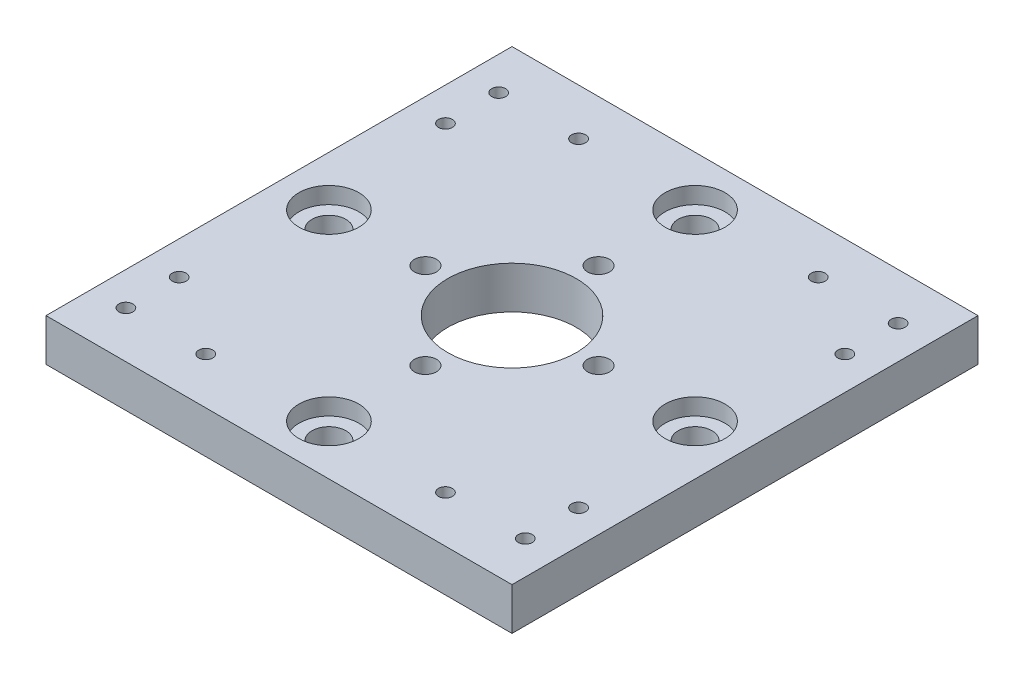
ISO-10303-21;
HEADER;
FILE_DESCRIPTION(('STEP AP214'),'2;1');
FILE_NAME('part.step','',(''),(''),'','','');
FILE_SCHEMA(('AUTOMOTIVE_DESIGN { 1 0 10303 214 1 1 1 1 }'));
ENDSEC;
DATA;
#1=APPLICATION_CONTEXT('core data for automotive mechanical design processes');
#2=APPLICATION_PROTOCOL_DEFINITION('international standard','automotive_design',2000,#1);
#3=PRODUCT_CONTEXT('',#1,'mechanical');
#4=PRODUCT('Part','Part','',(#3));
#5=PRODUCT_RELATED_PRODUCT_CATEGORY('part','',(#4));
#6=PRODUCT_DEFINITION_FORMATION('','',#4);
#7=PRODUCT_DEFINITION_CONTEXT('part definition',#1,'design');
#8=PRODUCT_DEFINITION('design','',#6,#7);
#9=PRODUCT_DEFINITION_SHAPE('','',#8);
#10=(LENGTH_UNIT() NAMED_UNIT(*) SI_UNIT(.MILLI.,.METRE.));
#11=(NAMED_UNIT(*) PLANE_ANGLE_UNIT() SI_UNIT($,.RADIAN.));
#12=(NAMED_UNIT(*) SI_UNIT($,.STERADIAN.) SOLID_ANGLE_UNIT());
#13=UNCERTAINTY_MEASURE_WITH_UNIT(LENGTH_MEASURE(1.E-05),#10,'distance_accuracy_value','');
#14=(GEOMETRIC_REPRESENTATION_CONTEXT(3) GLOBAL_UNCERTAINTY_ASSIGNED_CONTEXT((#13)) GLOBAL_UNIT_ASSIGNED_CONTEXT((#10,
#11,#12)) REPRESENTATION_CONTEXT('',''));
#15=CARTESIAN_POINT('',(0.,0.,0.));
#16=DIRECTION('',(0.,0.,1.));
#17=DIRECTION('',(1.,0.,0.));
#18=AXIS2_PLACEMENT_3D('',#15,#16,#17);
#19=CARTESIAN_POINT('',(1.55309068257925E-12,-0.00100000000000013,27.5));
#20=DIRECTION('',(0.,1.,0.));
#21=DIRECTION('',(0.,0.,1.));
#22=AXIS2_PLACEMENT_3D('',#19,#20,#21);
#23=CYLINDRICAL_SURFACE('',#22,2.55000000000167);
#24=CARTESIAN_POINT('',(1.55309068257925E-12,0.,27.5));
#25=DIRECTION('',(0.,1.,0.));
#26=DIRECTION('',(0.,0.,1.));
#27=AXIS2_PLACEMENT_3D('',#24,#25,#26);
#28=CIRCLE('',#27,2.55000000000167);
#29=CARTESIAN_POINT('',(1.55309068257925E-12,0.,30.0500000000017));
#30=VERTEX_POINT('',#29);
#31=EDGE_CURVE('E141',#30,#30,#28,.F.);
#32=ORIENTED_EDGE('',*,*,#31,.T.);
#33=EDGE_LOOP('',(#32));
#34=FACE_BOUND('',#33,.T.);
#35=CARTESIAN_POINT('',(1.55309068257925E-12,3.85,27.5));
#36=DIRECTION('',(0.,1.,0.));
#37=DIRECTION('',(0.,0.,1.));
#38=AXIS2_PLACEMENT_3D('',#35,#36,#37);
#39=CIRCLE('',#38,2.55000000000167);
#40=CARTESIAN_POINT('',(1.55309068257925E-12,3.85,30.0500000000017));
#41=VERTEX_POINT('',#40);
#42=EDGE_CURVE('E43',#41,#41,#39,.F.);
#43=ORIENTED_EDGE('',*,*,#42,.F.);
#44=EDGE_LOOP('',(#43));
#45=FACE_BOUND('',#44,.T.);
#46=ADVANCED_FACE('F39',(#34,#45),#23,.F.);
#47=CARTESIAN_POINT('',(27.5000000000008,-0.00100000000000013,-7.76545341289627E-13));
#48=DIRECTION('',(0.,1.,0.));
#49=DIRECTION('',(0.,0.,1.));
#50=AXIS2_PLACEMENT_3D('',#47,#48,#49);
#51=CYLINDRICAL_SURFACE('',#50,2.55000000000061);
#52=CARTESIAN_POINT('',(27.5000000000008,0.,-7.76545341289627E-13));
#53=DIRECTION('',(0.,1.,0.));
#54=DIRECTION('',(0.,0.,1.));
#55=AXIS2_PLACEMENT_3D('',#52,#53,#54);
#56=CIRCLE('',#55,2.55000000000061);
#57=CARTESIAN_POINT('',(27.5000000000008,0.,2.54999999999983));
#58=VERTEX_POINT('',#57);
#59=EDGE_CURVE('E145',#58,#58,#56,.F.);
#60=ORIENTED_EDGE('',*,*,#59,.T.);
#61=EDGE_LOOP('',(#60));
#62=FACE_BOUND('',#61,.T.);
#63=CARTESIAN_POINT('',(27.5000000000008,3.85,-7.76545341289627E-13));
#64=DIRECTION('',(0.,1.,0.));
#65=DIRECTION('',(0.,0.,1.));
#66=AXIS2_PLACEMENT_3D('',#63,#64,#65);
#67=CIRCLE('',#66,2.55000000000061);
#68=CARTESIAN_POINT('',(27.5000000000008,3.85,2.54999999999983));
#69=VERTEX_POINT('',#68);
#70=EDGE_CURVE('E136',#69,#69,#67,.F.);
#71=ORIENTED_EDGE('',*,*,#70,.F.);
#72=EDGE_LOOP('',(#71));
#73=FACE_BOUND('',#72,.T.);
#74=ADVANCED_FACE('F264',(#62,#73),#51,.F.);
#75=CARTESIAN_POINT('',(0.,-0.00100000000000013,-27.5));
#76=DIRECTION('',(0.,1.,0.));
#77=DIRECTION('',(0.,0.,1.));
#78=AXIS2_PLACEMENT_3D('',#75,#76,#77);
#79=CYLINDRICAL_SURFACE('',#78,2.55);
#80=CARTESIAN_POINT('',(0.,0.,-27.5));
#81=DIRECTION('',(0.,1.,0.));
#82=DIRECTION('',(0.,0.,1.));
#83=AXIS2_PLACEMENT_3D('',#80,#81,#82);
#84=CIRCLE('',#83,2.55);
#85=CARTESIAN_POINT('',(0.,0.,-24.95));
#86=VERTEX_POINT('',#85);
#87=EDGE_CURVE('E150',#86,#86,#84,.F.);
#88=ORIENTED_EDGE('',*,*,#87,.T.);
#89=EDGE_LOOP('',(#88));
#90=FACE_BOUND('',#89,.T.);
#91=CARTESIAN_POINT('',(0.,3.85,-27.5));
#92=DIRECTION('',(0.,1.,0.));
#93=DIRECTION('',(0.,0.,1.));
#94=AXIS2_PLACEMENT_3D('',#91,#92,#93);
#95=CIRCLE('',#94,2.55);
#96=CARTESIAN_POINT('',(0.,3.85,-24.95));
#97=VERTEX_POINT('',#96);
#98=EDGE_CURVE('E133',#97,#97,#95,.F.);
#99=ORIENTED_EDGE('',*,*,#98,.F.);
#100=EDGE_LOOP('',(#99));
#101=FACE_BOUND('',#100,.T.);
#102=ADVANCED_FACE('F269',(#90,#101),#79,.F.);
#103=CARTESIAN_POINT('',(-27.4999999999992,-0.00100000000000013,7.79913119987283E-13));
#104=DIRECTION('',(0.,1.,0.));
#105=DIRECTION('',(0.,0.,1.));
#106=AXIS2_PLACEMENT_3D('',#103,#104,#105);
#107=CYLINDRICAL_SURFACE('',#106,2.55000000000125);
#108=CARTESIAN_POINT('',(-27.4999999999992,0.,7.79913119987283E-13));
#109=DIRECTION('',(0.,1.,0.));
#110=DIRECTION('',(0.,0.,1.));
#111=AXIS2_PLACEMENT_3D('',#108,#109,#110);
#112=CIRCLE('',#111,2.55000000000125);
#113=CARTESIAN_POINT('',(-27.4999999999992,0.,2.55000000000203));
#114=VERTEX_POINT('',#113);
#115=EDGE_CURVE('E158',#114,#114,#112,.F.);
#116=ORIENTED_EDGE('',*,*,#115,.T.);
#117=EDGE_LOOP('',(#116));
#118=FACE_BOUND('',#117,.T.);
#119=CARTESIAN_POINT('',(-27.4999999999992,3.85,7.79913119987283E-13));
#120=DIRECTION('',(0.,1.,0.));
#121=DIRECTION('',(0.,0.,1.));
#122=AXIS2_PLACEMENT_3D('',#119,#120,#121);
#123=CIRCLE('',#122,2.55000000000125);
#124=CARTESIAN_POINT('',(-27.4999999999992,3.85,2.55000000000203));
#125=VERTEX_POINT('',#124);
#126=EDGE_CURVE('E130',#125,#125,#123,.F.);
#127=ORIENTED_EDGE('',*,*,#126,.F.);
#128=EDGE_LOOP('',(#127));
#129=FACE_BOUND('',#128,.T.);
#130=ADVANCED_FACE('F342',(#118,#129),#107,.F.);
#131=CARTESIAN_POINT('',(0.,6.35,35.));
#132=DIRECTION('',(0.,0.,-1.));
#133=DIRECTION('',(-1.,0.,0.));
#134=AXIS2_PLACEMENT_3D('',#131,#132,#133);
#135=PLANE('',#134);
#136=DIRECTION('',(1.,0.,0.));
#137=VECTOR('',#136,1.);
#138=CARTESIAN_POINT('',(0.,0.,35.));
#139=LINE('',#138,#137);
#140=CARTESIAN_POINT('',(-35.,0.,35.));
#141=VERTEX_POINT('',#140);
#142=CARTESIAN_POINT('',(35.,0.,35.));
#143=VERTEX_POINT('',#142);
#144=EDGE_CURVE('E119',#141,#143,#139,.T.);
#145=ORIENTED_EDGE('',*,*,#144,.T.);
#146=DIRECTION('',(0.,-1.,0.));
#147=VECTOR('',#146,1.);
#148=CARTESIAN_POINT('',(35.,6.35,35.));
#149=LINE('',#148,#147);
#150=CARTESIAN_POINT('',(35.,6.35,35.));
#151=VERTEX_POINT('',#150);
#152=EDGE_CURVE('E11',#151,#143,#149,.T.);
#153=ORIENTED_EDGE('',*,*,#152,.F.);
#154=DIRECTION('',(1.,0.,0.));
#155=VECTOR('',#154,1.);
#156=CARTESIAN_POINT('',(0.,6.35,35.));
#157=LINE('',#156,#155);
#158=CARTESIAN_POINT('',(-35.,6.35,35.));
#159=VERTEX_POINT('',#158);
#160=EDGE_CURVE('E91',#159,#151,#157,.T.);
#161=ORIENTED_EDGE('',*,*,#160,.F.);
#162=DIRECTION('',(0.,-1.,0.));
#163=VECTOR('',#162,1.);
#164=CARTESIAN_POINT('',(-35.,6.35,35.));
#165=LINE('',#164,#163);
#166=EDGE_CURVE('E58',#159,#141,#165,.T.);
#167=ORIENTED_EDGE('',*,*,#166,.T.);
#168=EDGE_LOOP('',(#145,#153,#161,#167));
#169=FACE_BOUND('',#168,.T.);
#170=ADVANCED_FACE('F340',(#169),#135,.F.);
#171=CARTESIAN_POINT('',(35.,6.35,0.));
#172=DIRECTION('',(-1.,0.,0.));
#173=DIRECTION('',(0.,0.,1.));
#174=AXIS2_PLACEMENT_3D('',#171,#172,#173);
#175=PLANE('',#174);
#176=DIRECTION('',(0.,0.,-1.));
#177=VECTOR('',#176,1.);
#178=CARTESIAN_POINT('',(35.,0.,0.));
#179=LINE('',#178,#177);
#180=CARTESIAN_POINT('',(35.,0.,-35.));
#181=VERTEX_POINT('',#180);
#182=EDGE_CURVE('E96',#143,#181,#179,.T.);
#183=ORIENTED_EDGE('',*,*,#182,.T.);
#184=DIRECTION('',(0.,-1.,0.));
#185=VECTOR('',#184,1.);
#186=CARTESIAN_POINT('',(35.,6.35,-35.));
#187=LINE('',#186,#185);
#188=CARTESIAN_POINT('',(35.,6.35,-35.));
#189=VERTEX_POINT('',#188);
#190=EDGE_CURVE('E49',#189,#181,#187,.T.);
#191=ORIENTED_EDGE('',*,*,#190,.F.);
#192=DIRECTION('',(0.,0.,-1.));
#193=VECTOR('',#192,1.);
#194=CARTESIAN_POINT('',(35.,6.35,0.));
#195=LINE('',#194,#193);
#196=EDGE_CURVE('E83',#151,#189,#195,.T.);
#197=ORIENTED_EDGE('',*,*,#196,.F.);
#198=ORIENTED_EDGE('',*,*,#152,.T.);
#199=EDGE_LOOP('',(#183,#191,#197,#198));
#200=FACE_BOUND('',#199,.T.);
#201=ADVANCED_FACE('F95',(#200),#175,.F.);
#202=CARTESIAN_POINT('',(0.,6.35,-35.));
#203=DIRECTION('',(0.,0.,-1.));
#204=DIRECTION('',(-1.,0.,0.));
#205=AXIS2_PLACEMENT_3D('',#202,#203,#204);
#206=PLANE('',#205);
#207=DIRECTION('',(1.,0.,0.));
#208=VECTOR('',#207,1.);
#209=CARTESIAN_POINT('',(0.,0.,-35.));
#210=LINE('',#209,#208);
#211=CARTESIAN_POINT('',(-35.,0.,-35.));
#212=VERTEX_POINT('',#211);
#213=EDGE_CURVE('E122',#212,#181,#210,.T.);
#214=ORIENTED_EDGE('',*,*,#213,.F.);
#215=DIRECTION('',(0.,-1.,0.));
#216=VECTOR('',#215,1.);
#217=CARTESIAN_POINT('',(-35.,6.35,-35.));
#218=LINE('',#217,#216);
#219=CARTESIAN_POINT('',(-35.,6.35,-35.));
#220=VERTEX_POINT('',#219);
#221=EDGE_CURVE('E72',#220,#212,#218,.T.);
#222=ORIENTED_EDGE('',*,*,#221,.F.);
#223=DIRECTION('',(1.,0.,0.));
#224=VECTOR('',#223,1.);
#225=CARTESIAN_POINT('',(0.,6.35,-35.));
#226=LINE('',#225,#224);
#227=EDGE_CURVE('E90',#220,#189,#226,.T.);
#228=ORIENTED_EDGE('',*,*,#227,.T.);
#229=ORIENTED_EDGE('',*,*,#190,.T.);
#230=EDGE_LOOP('',(#214,#222,#228,#229));
#231=FACE_BOUND('',#230,.T.);
#232=ADVANCED_FACE('F100',(#231),#206,.T.);
#233=CARTESIAN_POINT('',(0.,6.35,13.));
#234=DIRECTION('',(0.,-1.,0.));
#235=DIRECTION('',(0.,0.,-1.));
#236=AXIS2_PLACEMENT_3D('',#233,#234,#235);
#237=CYLINDRICAL_SURFACE('',#236,1.65);
#238=CARTESIAN_POINT('',(0.,6.35,13.));
#239=DIRECTION('',(0.,1.,0.));
#240=DIRECTION('',(0.,0.,1.));
#241=AXIS2_PLACEMENT_3D('',#238,#239,#240);
#242=CIRCLE('',#241,1.65);
#243=CARTESIAN_POINT('',(0.,6.35,14.65));
#244=VERTEX_POINT('',#243);
#245=EDGE_CURVE('E240',#244,#244,#242,.T.);
#246=ORIENTED_EDGE('',*,*,#245,.T.);
#247=EDGE_LOOP('',(#246));
#248=FACE_BOUND('',#247,.T.);
#249=CARTESIAN_POINT('',(0.,0.,13.));
#250=DIRECTION('',(0.,1.,0.));
#251=DIRECTION('',(0.,0.,1.));
#252=AXIS2_PLACEMENT_3D('',#249,#250,#251);
#253=CIRCLE('',#252,1.65);
#254=CARTESIAN_POINT('',(0.,0.,14.65));
#255=VERTEX_POINT('',#254);
#256=EDGE_CURVE('E116',#255,#255,#253,.T.);
#257=ORIENTED_EDGE('',*,*,#256,.F.);
#258=EDGE_LOOP('',(#257));
#259=FACE_BOUND('',#258,.T.);
#260=ADVANCED_FACE('F244',(#248,#259),#237,.F.);
#261=CARTESIAN_POINT('',(13.,6.35,0.));
#262=DIRECTION('',(0.,-1.,0.));
#263=DIRECTION('',(0.,0.,-1.));
#264=AXIS2_PLACEMENT_3D('',#261,#262,#263);
#265=CYLINDRICAL_SURFACE('',#264,1.65);
#266=CARTESIAN_POINT('',(13.,6.35,0.));
#267=DIRECTION('',(0.,1.,0.));
#268=DIRECTION('',(0.,0.,1.));
#269=AXIS2_PLACEMENT_3D('',#266,#267,#268);
#270=CIRCLE('',#269,1.65);
#271=CARTESIAN_POINT('',(13.,6.35,1.65));
#272=VERTEX_POINT('',#271);
#273=EDGE_CURVE('E237',#272,#272,#270,.T.);
#274=ORIENTED_EDGE('',*,*,#273,.T.);
#275=EDGE_LOOP('',(#274));
#276=FACE_BOUND('',#275,.T.);
#277=CARTESIAN_POINT('',(13.,0.,0.));
#278=DIRECTION('',(0.,1.,0.));
#279=DIRECTION('',(0.,0.,1.));
#280=AXIS2_PLACEMENT_3D('',#277,#278,#279);
#281=CIRCLE('',#280,1.65);
#282=CARTESIAN_POINT('',(13.,0.,1.65));
#283=VERTEX_POINT('',#282);
#284=EDGE_CURVE('E113',#283,#283,#281,.T.);
#285=ORIENTED_EDGE('',*,*,#284,.F.);
#286=EDGE_LOOP('',(#285));
#287=FACE_BOUND('',#286,.T.);
#288=ADVANCED_FACE('F355',(#276,#287),#265,.F.);
#289=CARTESIAN_POINT('',(0.,6.35,-13.));
#290=DIRECTION('',(0.,-1.,0.));
#291=DIRECTION('',(0.,0.,-1.));
#292=AXIS2_PLACEMENT_3D('',#289,#290,#291);
#293=CYLINDRICAL_SURFACE('',#292,1.65);
#294=CARTESIAN_POINT('',(0.,6.35,-13.));
#295=DIRECTION('',(0.,1.,0.));
#296=DIRECTION('',(0.,0.,1.));
#297=AXIS2_PLACEMENT_3D('',#294,#295,#296);
#298=CIRCLE('',#297,1.65);
#299=CARTESIAN_POINT('',(0.,6.35,-11.35));
#300=VERTEX_POINT('',#299);
#301=EDGE_CURVE('E234',#300,#300,#298,.T.);
#302=ORIENTED_EDGE('',*,*,#301,.T.);
#303=EDGE_LOOP('',(#302));
#304=FACE_BOUND('',#303,.T.);
#305=CARTESIAN_POINT('',(0.,0.,-13.));
#306=DIRECTION('',(0.,1.,0.));
#307=DIRECTION('',(0.,0.,1.));
#308=AXIS2_PLACEMENT_3D('',#305,#306,#307);
#309=CIRCLE('',#308,1.65);
#310=CARTESIAN_POINT('',(0.,0.,-11.35));
#311=VERTEX_POINT('',#310);
#312=EDGE_CURVE('E109',#311,#311,#309,.T.);
#313=ORIENTED_EDGE('',*,*,#312,.F.);
#314=EDGE_LOOP('',(#313));
#315=FACE_BOUND('',#314,.T.);
#316=ADVANCED_FACE('F357',(#304,#315),#293,.F.);
#317=CARTESIAN_POINT('',(-13.,6.35,0.));
#318=DIRECTION('',(0.,-1.,0.));
#319=DIRECTION('',(0.,0.,-1.));
#320=AXIS2_PLACEMENT_3D('',#317,#318,#319);
#321=CYLINDRICAL_SURFACE('',#320,1.65);
#322=CARTESIAN_POINT('',(-13.,6.35,0.));
#323=DIRECTION('',(0.,1.,0.));
#324=DIRECTION('',(0.,0.,1.));
#325=AXIS2_PLACEMENT_3D('',#322,#323,#324);
#326=CIRCLE('',#325,1.65);
#327=CARTESIAN_POINT('',(-13.,6.35,1.65));
#328=VERTEX_POINT('',#327);
#329=EDGE_CURVE('E127',#328,#328,#326,.T.);
#330=ORIENTED_EDGE('',*,*,#329,.T.);
#331=EDGE_LOOP('',(#330));
#332=FACE_BOUND('',#331,.T.);
#333=CARTESIAN_POINT('',(-13.,0.,0.));
#334=DIRECTION('',(0.,1.,0.));
#335=DIRECTION('',(0.,0.,1.));
#336=AXIS2_PLACEMENT_3D('',#333,#334,#335);
#337=CIRCLE('',#336,1.65);
#338=CARTESIAN_POINT('',(-13.,0.,1.65));
#339=VERTEX_POINT('',#338);
#340=EDGE_CURVE('E106',#339,#339,#337,.T.);
#341=ORIENTED_EDGE('',*,*,#340,.F.);
#342=EDGE_LOOP('',(#341));
#343=FACE_BOUND('',#342,.T.);
#344=ADVANCED_FACE('F41',(#332,#343),#321,.F.);
#345=CARTESIAN_POINT('',(-35.,6.35,0.));
#346=DIRECTION('',(-1.,0.,0.));
#347=DIRECTION('',(0.,0.,1.));
#348=AXIS2_PLACEMENT_3D('',#345,#346,#347);
#349=PLANE('',#348);
#350=DIRECTION('',(0.,0.,-1.));
#351=VECTOR('',#350,1.);
#352=CARTESIAN_POINT('',(-35.,0.,0.));
#353=LINE('',#352,#351);
#354=EDGE_CURVE('E124',#141,#212,#353,.T.);
#355=ORIENTED_EDGE('',*,*,#354,.F.);
#356=ORIENTED_EDGE('',*,*,#166,.F.);
#357=DIRECTION('',(0.,0.,-1.));
#358=VECTOR('',#357,1.);
#359=CARTESIAN_POINT('',(-35.,6.35,0.));
#360=LINE('',#359,#358);
#361=EDGE_CURVE('E101',#159,#220,#360,.T.);
#362=ORIENTED_EDGE('',*,*,#361,.T.);
#363=ORIENTED_EDGE('',*,*,#221,.T.);
#364=EDGE_LOOP('',(#355,#356,#362,#363));
#365=FACE_BOUND('',#364,.T.);
#366=ADVANCED_FACE('F249',(#365),#349,.T.);
#367=CARTESIAN_POINT('',(0.,6.35,0.));
#368=DIRECTION('',(0.,1.,0.));
#369=DIRECTION('',(0.,0.,1.));
#370=AXIS2_PLACEMENT_3D('',#367,#368,#369);
#371=PLANE('',#370);
#372=CARTESIAN_POINT('',(0.,6.35,-27.5));
#373=DIRECTION('',(0.,1.,0.));
#374=DIRECTION('',(0.,0.,1.));
#375=AXIS2_PLACEMENT_3D('',#372,#373,#374);
#376=CIRCLE('',#375,4.5);
#377=CARTESIAN_POINT('',(0.,6.35,-23.));
#378=VERTEX_POINT('',#377);
#379=EDGE_CURVE('E709',#378,#378,#376,.T.);
#380=ORIENTED_EDGE('',*,*,#379,.F.);
#381=EDGE_LOOP('',(#380));
#382=FACE_BOUND('',#381,.T.);
#383=CARTESIAN_POINT('',(27.5000000000008,6.35,-7.76545341289627E-13));
#384=DIRECTION('',(0.,1.,0.));
#385=DIRECTION('',(0.,0.,1.));
#386=AXIS2_PLACEMENT_3D('',#383,#384,#385);
#387=CIRCLE('',#386,4.5);
#388=CARTESIAN_POINT('',(27.5000000000008,6.35,4.49999999999923));
#389=VERTEX_POINT('',#388);
#390=EDGE_CURVE('E616',#389,#389,#387,.T.);
#391=ORIENTED_EDGE('',*,*,#390,.F.);
#392=EDGE_LOOP('',(#391));
#393=FACE_BOUND('',#392,.T.);
#394=CARTESIAN_POINT('',(1.55309068257925E-12,6.35,27.5));
#395=DIRECTION('',(0.,1.,0.));
#396=DIRECTION('',(0.,0.,1.));
#397=AXIS2_PLACEMENT_3D('',#394,#395,#396);
#398=CIRCLE('',#397,4.5);
#399=CARTESIAN_POINT('',(1.55309068257925E-12,6.35,32.));
#400=VERTEX_POINT('',#399);
#401=EDGE_CURVE('E611',#400,#400,#398,.T.);
#402=ORIENTED_EDGE('',*,*,#401,.F.);
#403=EDGE_LOOP('',(#402));
#404=FACE_BOUND('',#403,.T.);
#405=CARTESIAN_POINT('',(-27.4999999999992,6.35,7.79913119987283E-13));
#406=DIRECTION('',(0.,1.,0.));
#407=DIRECTION('',(0.,0.,1.));
#408=AXIS2_PLACEMENT_3D('',#405,#406,#407);
#409=CIRCLE('',#408,4.5);
#410=CARTESIAN_POINT('',(-27.4999999999992,6.35,4.50000000000078));
#411=VERTEX_POINT('',#410);
#412=EDGE_CURVE('E618',#411,#411,#409,.T.);
#413=ORIENTED_EDGE('',*,*,#412,.F.);
#414=EDGE_LOOP('',(#413));
#415=FACE_BOUND('',#414,.T.);
#416=CARTESIAN_POINT('',(0.,6.35,0.));
#417=DIRECTION('',(0.,1.,0.));
#418=DIRECTION('',(0.,0.,1.));
#419=AXIS2_PLACEMENT_3D('',#416,#417,#418);
#420=CIRCLE('',#419,9.65);
#421=CARTESIAN_POINT('',(0.,6.35,9.65));
#422=VERTEX_POINT('',#421);
#423=EDGE_CURVE('E154',#422,#422,#420,.T.);
#424=ORIENTED_EDGE('',*,*,#423,.F.);
#425=EDGE_LOOP('',(#424));
#426=FACE_BOUND('',#425,.T.);
#427=CARTESIAN_POINT('',(18.,6.35,28.));
#428=DIRECTION('',(0.,1.,0.));
#429=DIRECTION('',(0.,0.,-1.));
#430=AXIS2_PLACEMENT_3D('',#427,#428,#429);
#431=CIRCLE('',#430,1.05);
#432=CARTESIAN_POINT('',(18.,6.35,26.95));
#433=VERTEX_POINT('',#432);
#434=EDGE_CURVE('E197',#433,#433,#431,.T.);
#435=ORIENTED_EDGE('',*,*,#434,.F.);
#436=EDGE_LOOP('',(#435));
#437=FACE_BOUND('',#436,.T.);
#438=CARTESIAN_POINT('',(30.,6.35,28.));
#439=DIRECTION('',(0.,1.,0.));
#440=DIRECTION('',(0.,0.,-1.));
#441=AXIS2_PLACEMENT_3D('',#438,#439,#440);
#442=CIRCLE('',#441,1.05);
#443=CARTESIAN_POINT('',(30.,6.35,26.95));
#444=VERTEX_POINT('',#443);
#445=EDGE_CURVE('E191',#444,#444,#442,.T.);
#446=ORIENTED_EDGE('',*,*,#445,.F.);
#447=EDGE_LOOP('',(#446));
#448=FACE_BOUND('',#447,.T.);
#449=CARTESIAN_POINT('',(30.,6.35,20.));
#450=DIRECTION('',(0.,1.,0.));
#451=DIRECTION('',(0.,0.,-1.));
#452=AXIS2_PLACEMENT_3D('',#449,#450,#451);
#453=CIRCLE('',#452,1.05);
#454=CARTESIAN_POINT('',(30.,6.35,18.95));
#455=VERTEX_POINT('',#454);
#456=EDGE_CURVE('E184',#455,#455,#453,.T.);
#457=ORIENTED_EDGE('',*,*,#456,.F.);
#458=EDGE_LOOP('',(#457));
#459=FACE_BOUND('',#458,.T.);
#460=CARTESIAN_POINT('',(-18.,6.35,-28.));
#461=DIRECTION('',(0.,1.,0.));
#462=DIRECTION('',(0.,0.,-1.));
#463=AXIS2_PLACEMENT_3D('',#460,#461,#462);
#464=CIRCLE('',#463,1.05);
#465=CARTESIAN_POINT('',(-18.,6.35,-29.05));
#466=VERTEX_POINT('',#465);
#467=EDGE_CURVE('E183',#466,#466,#464,.T.);
#468=ORIENTED_EDGE('',*,*,#467,.F.);
#469=EDGE_LOOP('',(#468));
#470=FACE_BOUND('',#469,.T.);
#471=CARTESIAN_POINT('',(-30.,6.35,-28.));
#472=DIRECTION('',(0.,1.,0.));
#473=DIRECTION('',(0.,0.,-1.));
#474=AXIS2_PLACEMENT_3D('',#471,#472,#473);
#475=CIRCLE('',#474,1.05);
#476=CARTESIAN_POINT('',(-30.,6.35,-29.05));
#477=VERTEX_POINT('',#476);
#478=EDGE_CURVE('E221',#477,#477,#475,.T.);
#479=ORIENTED_EDGE('',*,*,#478,.F.);
#480=EDGE_LOOP('',(#479));
#481=FACE_BOUND('',#480,.T.);
#482=CARTESIAN_POINT('',(-30.,6.35,-20.));
#483=DIRECTION('',(0.,1.,0.));
#484=DIRECTION('',(0.,0.,-1.));
#485=AXIS2_PLACEMENT_3D('',#482,#483,#484);
#486=CIRCLE('',#485,1.05);
#487=CARTESIAN_POINT('',(-30.,6.35,-21.05));
#488=VERTEX_POINT('',#487);
#489=EDGE_CURVE('E215',#488,#488,#486,.T.);
#490=ORIENTED_EDGE('',*,*,#489,.F.);
#491=EDGE_LOOP('',(#490));
#492=FACE_BOUND('',#491,.T.);
#493=CARTESIAN_POINT('',(30.,6.35,-20.));
#494=DIRECTION('',(0.,1.,0.));
#495=DIRECTION('',(0.,0.,1.));
#496=AXIS2_PLACEMENT_3D('',#493,#494,#495);
#497=CIRCLE('',#496,1.05);
#498=CARTESIAN_POINT('',(30.,6.35,-18.95));
#499=VERTEX_POINT('',#498);
#500=EDGE_CURVE('E208',#499,#499,#497,.T.);
#501=ORIENTED_EDGE('',*,*,#500,.F.);
#502=EDGE_LOOP('',(#501));
#503=FACE_BOUND('',#502,.T.);
#504=CARTESIAN_POINT('',(30.,6.35,-28.));
#505=DIRECTION('',(0.,1.,0.));
#506=DIRECTION('',(0.,0.,1.));
#507=AXIS2_PLACEMENT_3D('',#504,#505,#506);
#508=CIRCLE('',#507,1.05);
#509=CARTESIAN_POINT('',(30.,6.35,-26.95));
#510=VERTEX_POINT('',#509);
#511=EDGE_CURVE('E207',#510,#510,#508,.T.);
#512=ORIENTED_EDGE('',*,*,#511,.F.);
#513=EDGE_LOOP('',(#512));
#514=FACE_BOUND('',#513,.T.);
#515=CARTESIAN_POINT('',(-30.,6.35,28.));
#516=DIRECTION('',(0.,1.,0.));
#517=DIRECTION('',(0.,0.,1.));
#518=AXIS2_PLACEMENT_3D('',#515,#516,#517);
#519=CIRCLE('',#518,1.05);
#520=CARTESIAN_POINT('',(-30.,6.35,29.05));
#521=VERTEX_POINT('',#520);
#522=EDGE_CURVE('E164',#521,#521,#519,.T.);
#523=ORIENTED_EDGE('',*,*,#522,.F.);
#524=EDGE_LOOP('',(#523));
#525=FACE_BOUND('',#524,.T.);
#526=CARTESIAN_POINT('',(-30.,6.35,20.));
#527=DIRECTION('',(0.,1.,0.));
#528=DIRECTION('',(0.,0.,1.));
#529=AXIS2_PLACEMENT_3D('',#526,#527,#528);
#530=CIRCLE('',#529,1.05);
#531=CARTESIAN_POINT('',(-30.,6.35,21.05));
#532=VERTEX_POINT('',#531);
#533=EDGE_CURVE('E172',#532,#532,#530,.T.);
#534=ORIENTED_EDGE('',*,*,#533,.F.);
#535=EDGE_LOOP('',(#534));
#536=FACE_BOUND('',#535,.T.);
#537=CARTESIAN_POINT('',(-18.,6.35,28.));
#538=DIRECTION('',(0.,1.,0.));
#539=DIRECTION('',(0.,0.,1.));
#540=AXIS2_PLACEMENT_3D('',#537,#538,#539);
#541=CIRCLE('',#540,1.05);
#542=CARTESIAN_POINT('',(-18.,6.35,29.05));
#543=VERTEX_POINT('',#542);
#544=EDGE_CURVE('E171',#543,#543,#541,.T.);
#545=ORIENTED_EDGE('',*,*,#544,.F.);
#546=EDGE_LOOP('',(#545));
#547=FACE_BOUND('',#546,.T.);
#548=CARTESIAN_POINT('',(18.,6.35,-28.));
#549=DIRECTION('',(0.,1.,0.));
#550=DIRECTION('',(0.,0.,1.));
#551=AXIS2_PLACEMENT_3D('',#548,#549,#550);
#552=CIRCLE('',#551,1.05);
#553=CARTESIAN_POINT('',(18.,6.35,-26.95));
#554=VERTEX_POINT('',#553);
#555=EDGE_CURVE('E211',#554,#554,#552,.T.);
#556=ORIENTED_EDGE('',*,*,#555,.F.);
#557=EDGE_LOOP('',(#556));
#558=FACE_BOUND('',#557,.T.);
#559=ORIENTED_EDGE('',*,*,#329,.F.);
#560=EDGE_LOOP('',(#559));
#561=FACE_BOUND('',#560,.T.);
#562=ORIENTED_EDGE('',*,*,#301,.F.);
#563=EDGE_LOOP('',(#562));
#564=FACE_BOUND('',#563,.T.);
#565=ORIENTED_EDGE('',*,*,#273,.F.);
#566=EDGE_LOOP('',(#565));
#567=FACE_BOUND('',#566,.T.);
#568=ORIENTED_EDGE('',*,*,#245,.F.);
#569=EDGE_LOOP('',(#568));
#570=FACE_BOUND('',#569,.T.);
#571=ORIENTED_EDGE('',*,*,#160,.T.);
#572=ORIENTED_EDGE('',*,*,#196,.T.);
#573=ORIENTED_EDGE('',*,*,#227,.F.);
#574=ORIENTED_EDGE('',*,*,#361,.F.);
#575=EDGE_LOOP('',(#571,#572,#573,#574));
#576=FACE_BOUND('',#575,.T.);
#577=ADVANCED_FACE('F87',(#382,#393,#404,#415,#426,#437,#448,#459,#470,#481,#492,#503,#514,#525,
#536,#547,#558,#561,#564,#567,#570,#576),#371,.T.);
#578=CARTESIAN_POINT('',(0.,0.,0.));
#579=DIRECTION('',(0.,1.,0.));
#580=DIRECTION('',(0.,0.,1.));
#581=AXIS2_PLACEMENT_3D('',#578,#579,#580);
#582=PLANE('',#581);
#583=ORIENTED_EDGE('',*,*,#115,.F.);
#584=EDGE_LOOP('',(#583));
#585=FACE_BOUND('',#584,.T.);
#586=ORIENTED_EDGE('',*,*,#87,.F.);
#587=EDGE_LOOP('',(#586));
#588=FACE_BOUND('',#587,.T.);
#589=ORIENTED_EDGE('',*,*,#59,.F.);
#590=EDGE_LOOP('',(#589));
#591=FACE_BOUND('',#590,.T.);
#592=ORIENTED_EDGE('',*,*,#31,.F.);
#593=EDGE_LOOP('',(#592));
#594=FACE_BOUND('',#593,.T.);
#595=CARTESIAN_POINT('',(0.,0.,0.));
#596=DIRECTION('',(0.,1.,0.));
#597=DIRECTION('',(0.,0.,1.));
#598=AXIS2_PLACEMENT_3D('',#595,#596,#597);
#599=CIRCLE('',#598,9.65);
#600=CARTESIAN_POINT('',(0.,0.,9.65));
#601=VERTEX_POINT('',#600);
#602=EDGE_CURVE('E157',#601,#601,#599,.F.);
#603=ORIENTED_EDGE('',*,*,#602,.F.);
#604=EDGE_LOOP('',(#603));
#605=FACE_BOUND('',#604,.T.);
#606=CARTESIAN_POINT('',(18.,0.,28.));
#607=DIRECTION('',(0.,1.,0.));
#608=DIRECTION('',(0.,0.,1.));
#609=AXIS2_PLACEMENT_3D('',#606,#607,#608);
#610=CIRCLE('',#609,1.05);
#611=CARTESIAN_POINT('',(18.,0.,29.05));
#612=VERTEX_POINT('',#611);
#613=EDGE_CURVE('E175',#612,#612,#610,.F.);
#614=ORIENTED_EDGE('',*,*,#613,.F.);
#615=EDGE_LOOP('',(#614));
#616=FACE_BOUND('',#615,.T.);
#617=CARTESIAN_POINT('',(30.,0.,28.));
#618=DIRECTION('',(0.,1.,0.));
#619=DIRECTION('',(0.,0.,1.));
#620=AXIS2_PLACEMENT_3D('',#617,#618,#619);
#621=CIRCLE('',#620,1.05);
#622=CARTESIAN_POINT('',(30.,0.,29.05));
#623=VERTEX_POINT('',#622);
#624=EDGE_CURVE('E194',#623,#623,#621,.F.);
#625=ORIENTED_EDGE('',*,*,#624,.F.);
#626=EDGE_LOOP('',(#625));
#627=FACE_BOUND('',#626,.T.);
#628=CARTESIAN_POINT('',(30.,0.,20.));
#629=DIRECTION('',(0.,1.,0.));
#630=DIRECTION('',(0.,0.,1.));
#631=AXIS2_PLACEMENT_3D('',#628,#629,#630);
#632=CIRCLE('',#631,1.05);
#633=CARTESIAN_POINT('',(30.,0.,21.05));
#634=VERTEX_POINT('',#633);
#635=EDGE_CURVE('E188',#634,#634,#632,.F.);
#636=ORIENTED_EDGE('',*,*,#635,.F.);
#637=EDGE_LOOP('',(#636));
#638=FACE_BOUND('',#637,.T.);
#639=CARTESIAN_POINT('',(-18.,0.,-28.));
#640=DIRECTION('',(0.,1.,0.));
#641=DIRECTION('',(0.,0.,1.));
#642=AXIS2_PLACEMENT_3D('',#639,#640,#641);
#643=CIRCLE('',#642,1.05);
#644=CARTESIAN_POINT('',(-18.,0.,-26.95));
#645=VERTEX_POINT('',#644);
#646=EDGE_CURVE('E180',#645,#645,#643,.F.);
#647=ORIENTED_EDGE('',*,*,#646,.F.);
#648=EDGE_LOOP('',(#647));
#649=FACE_BOUND('',#648,.T.);
#650=CARTESIAN_POINT('',(-30.,0.,-28.));
#651=DIRECTION('',(0.,1.,0.));
#652=DIRECTION('',(0.,0.,1.));
#653=AXIS2_PLACEMENT_3D('',#650,#651,#652);
#654=CIRCLE('',#653,1.05);
#655=CARTESIAN_POINT('',(-30.,0.,-26.95));
#656=VERTEX_POINT('',#655);
#657=EDGE_CURVE('E187',#656,#656,#654,.F.);
#658=ORIENTED_EDGE('',*,*,#657,.F.);
#659=EDGE_LOOP('',(#658));
#660=FACE_BOUND('',#659,.T.);
#661=CARTESIAN_POINT('',(-30.,0.,-20.));
#662=DIRECTION('',(0.,1.,0.));
#663=DIRECTION('',(0.,0.,1.));
#664=AXIS2_PLACEMENT_3D('',#661,#662,#663);
#665=CIRCLE('',#664,1.05);
#666=CARTESIAN_POINT('',(-30.,0.,-18.95));
#667=VERTEX_POINT('',#666);
#668=EDGE_CURVE('E218',#667,#667,#665,.F.);
#669=ORIENTED_EDGE('',*,*,#668,.F.);
#670=EDGE_LOOP('',(#669));
#671=FACE_BOUND('',#670,.T.);
#672=CARTESIAN_POINT('',(30.,0.,-20.));
#673=DIRECTION('',(0.,1.,0.));
#674=DIRECTION('',(0.,0.,1.));
#675=AXIS2_PLACEMENT_3D('',#672,#673,#674);
#676=CIRCLE('',#675,1.05);
#677=CARTESIAN_POINT('',(30.,0.,-18.95));
#678=VERTEX_POINT('',#677);
#679=EDGE_CURVE('E212',#678,#678,#676,.F.);
#680=ORIENTED_EDGE('',*,*,#679,.F.);
#681=EDGE_LOOP('',(#680));
#682=FACE_BOUND('',#681,.T.);
#683=CARTESIAN_POINT('',(30.,0.,-28.));
#684=DIRECTION('',(0.,1.,0.));
#685=DIRECTION('',(0.,0.,1.));
#686=AXIS2_PLACEMENT_3D('',#683,#684,#685);
#687=CIRCLE('',#686,1.05);
#688=CARTESIAN_POINT('',(30.,0.,-26.95));
#689=VERTEX_POINT('',#688);
#690=EDGE_CURVE('E204',#689,#689,#687,.F.);
#691=ORIENTED_EDGE('',*,*,#690,.F.);
#692=EDGE_LOOP('',(#691));
#693=FACE_BOUND('',#692,.T.);
#694=CARTESIAN_POINT('',(-30.,0.,28.));
#695=DIRECTION('',(0.,1.,0.));
#696=DIRECTION('',(0.,0.,1.));
#697=AXIS2_PLACEMENT_3D('',#694,#695,#696);
#698=CIRCLE('',#697,1.05);
#699=CARTESIAN_POINT('',(-30.,0.,29.05));
#700=VERTEX_POINT('',#699);
#701=EDGE_CURVE('E161',#700,#700,#698,.F.);
#702=ORIENTED_EDGE('',*,*,#701,.F.);
#703=EDGE_LOOP('',(#702));
#704=FACE_BOUND('',#703,.T.);
#705=CARTESIAN_POINT('',(-30.,0.,20.));
#706=DIRECTION('',(0.,1.,0.));
#707=DIRECTION('',(0.,0.,1.));
#708=AXIS2_PLACEMENT_3D('',#705,#706,#707);
#709=CIRCLE('',#708,1.05);
#710=CARTESIAN_POINT('',(-30.,0.,21.05));
#711=VERTEX_POINT('',#710);
#712=EDGE_CURVE('E167',#711,#711,#709,.F.);
#713=ORIENTED_EDGE('',*,*,#712,.F.);
#714=EDGE_LOOP('',(#713));
#715=FACE_BOUND('',#714,.T.);
#716=CARTESIAN_POINT('',(-18.,0.,28.));
#717=DIRECTION('',(0.,1.,0.));
#718=DIRECTION('',(0.,0.,1.));
#719=AXIS2_PLACEMENT_3D('',#716,#717,#718);
#720=CIRCLE('',#719,1.05);
#721=CARTESIAN_POINT('',(-18.,0.,29.05));
#722=VERTEX_POINT('',#721);
#723=EDGE_CURVE('E168',#722,#722,#720,.F.);
#724=ORIENTED_EDGE('',*,*,#723,.F.);
#725=EDGE_LOOP('',(#724));
#726=FACE_BOUND('',#725,.T.);
#727=CARTESIAN_POINT('',(18.,0.,-28.));
#728=DIRECTION('',(0.,1.,0.));
#729=DIRECTION('',(0.,0.,1.));
#730=AXIS2_PLACEMENT_3D('',#727,#728,#729);
#731=CIRCLE('',#730,1.05);
#732=CARTESIAN_POINT('',(18.,0.,-26.95));
#733=VERTEX_POINT('',#732);
#734=EDGE_CURVE('E110',#733,#733,#731,.F.);
#735=ORIENTED_EDGE('',*,*,#734,.F.);
#736=EDGE_LOOP('',(#735));
#737=FACE_BOUND('',#736,.T.);
#738=ORIENTED_EDGE('',*,*,#340,.T.);
#739=EDGE_LOOP('',(#738));
#740=FACE_BOUND('',#739,.T.);
#741=ORIENTED_EDGE('',*,*,#312,.T.);
#742=EDGE_LOOP('',(#741));
#743=FACE_BOUND('',#742,.T.);
#744=ORIENTED_EDGE('',*,*,#284,.T.);
#745=EDGE_LOOP('',(#744));
#746=FACE_BOUND('',#745,.T.);
#747=ORIENTED_EDGE('',*,*,#256,.T.);
#748=EDGE_LOOP('',(#747));
#749=FACE_BOUND('',#748,.T.);
#750=ORIENTED_EDGE('',*,*,#144,.F.);
#751=ORIENTED_EDGE('',*,*,#354,.T.);
#752=ORIENTED_EDGE('',*,*,#213,.T.);
#753=ORIENTED_EDGE('',*,*,#182,.F.);
#754=EDGE_LOOP('',(#750,#751,#752,#753));
#755=FACE_BOUND('',#754,.T.);
#756=ADVANCED_FACE('F248',(#585,#588,#591,#594,#605,#616,#627,#638,#649,#660,#671,#682,#693,
#704,#715,#726,#737,#740,#743,#746,#749,#755),#582,.F.);
#757=CARTESIAN_POINT('',(18.,-0.00100000000000013,-28.));
#758=DIRECTION('',(0.,1.,0.));
#759=DIRECTION('',(0.,0.,1.));
#760=AXIS2_PLACEMENT_3D('',#757,#758,#759);
#761=CYLINDRICAL_SURFACE('',#760,1.05);
#762=ORIENTED_EDGE('',*,*,#555,.T.);
#763=EDGE_LOOP('',(#762));
#764=FACE_BOUND('',#763,.T.);
#765=ORIENTED_EDGE('',*,*,#734,.T.);
#766=EDGE_LOOP('',(#765));
#767=FACE_BOUND('',#766,.T.);
#768=ADVANCED_FACE('F256',(#764,#767),#761,.F.);
#769=CARTESIAN_POINT('',(-18.,-0.00100000000000013,28.));
#770=DIRECTION('',(0.,1.,0.));
#771=DIRECTION('',(0.,0.,1.));
#772=AXIS2_PLACEMENT_3D('',#769,#770,#771);
#773=CYLINDRICAL_SURFACE('',#772,1.05);
#774=ORIENTED_EDGE('',*,*,#544,.T.);
#775=EDGE_LOOP('',(#774));
#776=FACE_BOUND('',#775,.T.);
#777=ORIENTED_EDGE('',*,*,#723,.T.);
#778=EDGE_LOOP('',(#777));
#779=FACE_BOUND('',#778,.T.);
#780=ADVANCED_FACE('F287',(#776,#779),#773,.F.);
#781=CARTESIAN_POINT('',(-30.,-0.00100000000000013,20.));
#782=DIRECTION('',(0.,1.,0.));
#783=DIRECTION('',(0.,0.,1.));
#784=AXIS2_PLACEMENT_3D('',#781,#782,#783);
#785=CYLINDRICAL_SURFACE('',#784,1.05);
#786=ORIENTED_EDGE('',*,*,#533,.T.);
#787=EDGE_LOOP('',(#786));
#788=FACE_BOUND('',#787,.T.);
#789=ORIENTED_EDGE('',*,*,#712,.T.);
#790=EDGE_LOOP('',(#789));
#791=FACE_BOUND('',#790,.T.);
#792=ADVANCED_FACE('F285',(#788,#791),#785,.F.);
#793=CARTESIAN_POINT('',(-30.,-0.00100000000000013,28.));
#794=DIRECTION('',(0.,1.,0.));
#795=DIRECTION('',(0.,0.,1.));
#796=AXIS2_PLACEMENT_3D('',#793,#794,#795);
#797=CYLINDRICAL_SURFACE('',#796,1.05);
#798=ORIENTED_EDGE('',*,*,#522,.T.);
#799=EDGE_LOOP('',(#798));
#800=FACE_BOUND('',#799,.T.);
#801=ORIENTED_EDGE('',*,*,#701,.T.);
#802=EDGE_LOOP('',(#801));
#803=FACE_BOUND('',#802,.T.);
#804=ADVANCED_FACE('F281',(#800,#803),#797,.F.);
#805=CARTESIAN_POINT('',(30.,-0.00100000000000013,-28.));
#806=DIRECTION('',(0.,1.,0.));
#807=DIRECTION('',(0.,0.,1.));
#808=AXIS2_PLACEMENT_3D('',#805,#806,#807);
#809=CYLINDRICAL_SURFACE('',#808,1.05);
#810=ORIENTED_EDGE('',*,*,#511,.T.);
#811=EDGE_LOOP('',(#810));
#812=FACE_BOUND('',#811,.T.);
#813=ORIENTED_EDGE('',*,*,#690,.T.);
#814=EDGE_LOOP('',(#813));
#815=FACE_BOUND('',#814,.T.);
#816=ADVANCED_FACE('F284',(#812,#815),#809,.F.);
#817=CARTESIAN_POINT('',(30.,-0.00100000000000013,-20.));
#818=DIRECTION('',(0.,1.,0.));
#819=DIRECTION('',(0.,0.,1.));
#820=AXIS2_PLACEMENT_3D('',#817,#818,#819);
#821=CYLINDRICAL_SURFACE('',#820,1.05);
#822=ORIENTED_EDGE('',*,*,#500,.T.);
#823=EDGE_LOOP('',(#822));
#824=FACE_BOUND('',#823,.T.);
#825=ORIENTED_EDGE('',*,*,#679,.T.);
#826=EDGE_LOOP('',(#825));
#827=FACE_BOUND('',#826,.T.);
#828=ADVANCED_FACE('F312',(#824,#827),#821,.F.);
#829=CARTESIAN_POINT('',(-30.,-0.00100000000000013,-20.));
#830=DIRECTION('',(0.,1.,0.));
#831=DIRECTION('',(0.,0.,1.));
#832=AXIS2_PLACEMENT_3D('',#829,#830,#831);
#833=CYLINDRICAL_SURFACE('',#832,1.05);
#834=ORIENTED_EDGE('',*,*,#489,.T.);
#835=EDGE_LOOP('',(#834));
#836=FACE_BOUND('',#835,.T.);
#837=ORIENTED_EDGE('',*,*,#668,.T.);
#838=EDGE_LOOP('',(#837));
#839=FACE_BOUND('',#838,.T.);
#840=ADVANCED_FACE('F316',(#836,#839),#833,.F.);
#841=CARTESIAN_POINT('',(-30.,-0.00100000000000013,-28.));
#842=DIRECTION('',(0.,1.,0.));
#843=DIRECTION('',(0.,0.,1.));
#844=AXIS2_PLACEMENT_3D('',#841,#842,#843);
#845=CYLINDRICAL_SURFACE('',#844,1.05);
#846=ORIENTED_EDGE('',*,*,#478,.T.);
#847=EDGE_LOOP('',(#846));
#848=FACE_BOUND('',#847,.T.);
#849=ORIENTED_EDGE('',*,*,#657,.T.);
#850=EDGE_LOOP('',(#849));
#851=FACE_BOUND('',#850,.T.);
#852=ADVANCED_FACE('F298',(#848,#851),#845,.F.);
#853=CARTESIAN_POINT('',(-18.,-0.00100000000000013,-28.));
#854=DIRECTION('',(0.,1.,0.));
#855=DIRECTION('',(0.,0.,1.));
#856=AXIS2_PLACEMENT_3D('',#853,#854,#855);
#857=CYLINDRICAL_SURFACE('',#856,1.05);
#858=ORIENTED_EDGE('',*,*,#467,.T.);
#859=EDGE_LOOP('',(#858));
#860=FACE_BOUND('',#859,.T.);
#861=ORIENTED_EDGE('',*,*,#646,.T.);
#862=EDGE_LOOP('',(#861));
#863=FACE_BOUND('',#862,.T.);
#864=ADVANCED_FACE('F294',(#860,#863),#857,.F.);
#865=CARTESIAN_POINT('',(30.,-0.00100000000000013,20.));
#866=DIRECTION('',(0.,1.,0.));
#867=DIRECTION('',(0.,0.,1.));
#868=AXIS2_PLACEMENT_3D('',#865,#866,#867);
#869=CYLINDRICAL_SURFACE('',#868,1.05);
#870=ORIENTED_EDGE('',*,*,#456,.T.);
#871=EDGE_LOOP('',(#870));
#872=FACE_BOUND('',#871,.T.);
#873=ORIENTED_EDGE('',*,*,#635,.T.);
#874=EDGE_LOOP('',(#873));
#875=FACE_BOUND('',#874,.T.);
#876=ADVANCED_FACE('F297',(#872,#875),#869,.F.);
#877=CARTESIAN_POINT('',(30.,-0.00100000000000013,28.));
#878=DIRECTION('',(0.,1.,0.));
#879=DIRECTION('',(0.,0.,1.));
#880=AXIS2_PLACEMENT_3D('',#877,#878,#879);
#881=CYLINDRICAL_SURFACE('',#880,1.05);
#882=ORIENTED_EDGE('',*,*,#445,.T.);
#883=EDGE_LOOP('',(#882));
#884=FACE_BOUND('',#883,.T.);
#885=ORIENTED_EDGE('',*,*,#624,.T.);
#886=EDGE_LOOP('',(#885));
#887=FACE_BOUND('',#886,.T.);
#888=ADVANCED_FACE('F302',(#884,#887),#881,.F.);
#889=CARTESIAN_POINT('',(18.,-0.00100000000000013,28.));
#890=DIRECTION('',(0.,1.,0.));
#891=DIRECTION('',(0.,0.,1.));
#892=AXIS2_PLACEMENT_3D('',#889,#890,#891);
#893=CYLINDRICAL_SURFACE('',#892,1.05);
#894=ORIENTED_EDGE('',*,*,#434,.T.);
#895=EDGE_LOOP('',(#894));
#896=FACE_BOUND('',#895,.T.);
#897=ORIENTED_EDGE('',*,*,#613,.T.);
#898=EDGE_LOOP('',(#897));
#899=FACE_BOUND('',#898,.T.);
#900=ADVANCED_FACE('F279',(#896,#899),#893,.F.);
#901=CARTESIAN_POINT('',(0.,-0.00100000000000013,0.));
#902=DIRECTION('',(0.,1.,0.));
#903=DIRECTION('',(0.,0.,1.));
#904=AXIS2_PLACEMENT_3D('',#901,#902,#903);
#905=CYLINDRICAL_SURFACE('',#904,9.65);
#906=ORIENTED_EDGE('',*,*,#423,.T.);
#907=EDGE_LOOP('',(#906));
#908=FACE_BOUND('',#907,.T.);
#909=ORIENTED_EDGE('',*,*,#602,.T.);
#910=EDGE_LOOP('',(#909));
#911=FACE_BOUND('',#910,.T.);
#912=ADVANCED_FACE('F275',(#908,#911),#905,.F.);
#913=CARTESIAN_POINT('',(-27.4999999999992,3.85,7.79913119987283E-13));
#914=DIRECTION('',(0.,1.,0.));
#915=DIRECTION('',(0.,0.,1.));
#916=AXIS2_PLACEMENT_3D('',#913,#914,#915);
#917=PLANE('',#916);
#918=CARTESIAN_POINT('',(-27.4999999999992,3.85,7.79913119987283E-13));
#919=DIRECTION('',(0.,1.,0.));
#920=DIRECTION('',(0.,0.,1.));
#921=AXIS2_PLACEMENT_3D('',#918,#919,#920);
#922=CIRCLE('',#921,4.5);
#923=CARTESIAN_POINT('',(-27.4999999999992,3.85,4.50000000000078));
#924=VERTEX_POINT('',#923);
#925=EDGE_CURVE('E624',#924,#924,#922,.T.);
#926=ORIENTED_EDGE('',*,*,#925,.T.);
#927=EDGE_LOOP('',(#926));
#928=FACE_BOUND('',#927,.T.);
#929=ORIENTED_EDGE('',*,*,#126,.T.);
#930=EDGE_LOOP('',(#929));
#931=FACE_BOUND('',#930,.T.);
#932=ADVANCED_FACE('F278',(#928,#931),#917,.T.);
#933=CARTESIAN_POINT('',(-27.4999999999992,3.85,7.79913119987283E-13));
#934=DIRECTION('',(0.,1.,0.));
#935=DIRECTION('',(0.,0.,1.));
#936=AXIS2_PLACEMENT_3D('',#933,#934,#935);
#937=CYLINDRICAL_SURFACE('',#936,4.5);
#938=ORIENTED_EDGE('',*,*,#925,.F.);
#939=EDGE_LOOP('',(#938));
#940=FACE_BOUND('',#939,.T.);
#941=ORIENTED_EDGE('',*,*,#412,.T.);
#942=EDGE_LOOP('',(#941));
#943=FACE_BOUND('',#942,.T.);
#944=ADVANCED_FACE('F516',(#940,#943),#937,.F.);
#945=CARTESIAN_POINT('',(0.,3.85,-27.5));
#946=DIRECTION('',(0.,1.,0.));
#947=DIRECTION('',(0.,0.,1.));
#948=AXIS2_PLACEMENT_3D('',#945,#946,#947);
#949=PLANE('',#948);
#950=CARTESIAN_POINT('',(0.,3.85,-27.5));
#951=DIRECTION('',(0.,1.,0.));
#952=DIRECTION('',(0.,0.,1.));
#953=AXIS2_PLACEMENT_3D('',#950,#951,#952);
#954=CIRCLE('',#953,4.5);
#955=CARTESIAN_POINT('',(0.,3.85,-23.));
#956=VERTEX_POINT('',#955);
#957=EDGE_CURVE('E134',#956,#956,#954,.T.);
#958=ORIENTED_EDGE('',*,*,#957,.T.);
#959=EDGE_LOOP('',(#958));
#960=FACE_BOUND('',#959,.T.);
#961=ORIENTED_EDGE('',*,*,#98,.T.);
#962=EDGE_LOOP('',(#961));
#963=FACE_BOUND('',#962,.T.);
#964=ADVANCED_FACE('F526',(#960,#963),#949,.T.);
#965=CARTESIAN_POINT('',(0.,3.85,-27.5));
#966=DIRECTION('',(0.,1.,0.));
#967=DIRECTION('',(0.,0.,1.));
#968=AXIS2_PLACEMENT_3D('',#965,#966,#967);
#969=CYLINDRICAL_SURFACE('',#968,4.5);
#970=ORIENTED_EDGE('',*,*,#957,.F.);
#971=EDGE_LOOP('',(#970));
#972=FACE_BOUND('',#971,.T.);
#973=ORIENTED_EDGE('',*,*,#379,.T.);
#974=EDGE_LOOP('',(#973));
#975=FACE_BOUND('',#974,.T.);
#976=ADVANCED_FACE('F537',(#972,#975),#969,.F.);
#977=CARTESIAN_POINT('',(27.5000000000008,3.85,-7.76545341289627E-13));
#978=DIRECTION('',(0.,1.,0.));
#979=DIRECTION('',(0.,0.,1.));
#980=AXIS2_PLACEMENT_3D('',#977,#978,#979);
#981=PLANE('',#980);
#982=CARTESIAN_POINT('',(27.5000000000008,3.85,-7.76545341289627E-13));
#983=DIRECTION('',(0.,1.,0.));
#984=DIRECTION('',(0.,0.,1.));
#985=AXIS2_PLACEMENT_3D('',#982,#983,#984);
#986=CIRCLE('',#985,4.5);
#987=CARTESIAN_POINT('',(27.5000000000008,3.85,4.49999999999923));
#988=VERTEX_POINT('',#987);
#989=EDGE_CURVE('E613',#988,#988,#986,.T.);
#990=ORIENTED_EDGE('',*,*,#989,.T.);
#991=EDGE_LOOP('',(#990));
#992=FACE_BOUND('',#991,.T.);
#993=ORIENTED_EDGE('',*,*,#70,.T.);
#994=EDGE_LOOP('',(#993));
#995=FACE_BOUND('',#994,.T.);
#996=ADVANCED_FACE('F548',(#992,#995),#981,.T.);
#997=CARTESIAN_POINT('',(27.5000000000008,3.85,-7.76545341289627E-13));
#998=DIRECTION('',(0.,1.,0.));
#999=DIRECTION('',(0.,0.,1.));
#1000=AXIS2_PLACEMENT_3D('',#997,#998,#999);
#1001=CYLINDRICAL_SURFACE('',#1000,4.5);
#1002=ORIENTED_EDGE('',*,*,#989,.F.);
#1003=EDGE_LOOP('',(#1002));
#1004=FACE_BOUND('',#1003,.T.);
#1005=ORIENTED_EDGE('',*,*,#390,.T.);
#1006=EDGE_LOOP('',(#1005));
#1007=FACE_BOUND('',#1006,.T.);
#1008=ADVANCED_FACE('F559',(#1004,#1007),#1001,.F.);
#1009=CARTESIAN_POINT('',(1.55309068257925E-12,3.85,27.5));
#1010=DIRECTION('',(0.,1.,0.));
#1011=DIRECTION('',(0.,0.,1.));
#1012=AXIS2_PLACEMENT_3D('',#1009,#1010,#1011);
#1013=PLANE('',#1012);
#1014=CARTESIAN_POINT('',(1.55309068257925E-12,3.85,27.5));
#1015=DIRECTION('',(0.,1.,0.));
#1016=DIRECTION('',(0.,0.,1.));
#1017=AXIS2_PLACEMENT_3D('',#1014,#1015,#1016);
#1018=CIRCLE('',#1017,4.5);
#1019=CARTESIAN_POINT('',(1.55309068257925E-12,3.85,32.));
#1020=VERTEX_POINT('',#1019);
#1021=EDGE_CURVE('E608',#1020,#1020,#1018,.T.);
#1022=ORIENTED_EDGE('',*,*,#1021,.T.);
#1023=EDGE_LOOP('',(#1022));
#1024=FACE_BOUND('',#1023,.T.);
#1025=ORIENTED_EDGE('',*,*,#42,.T.);
#1026=EDGE_LOOP('',(#1025));
#1027=FACE_BOUND('',#1026,.T.);
#1028=ADVANCED_FACE('F570',(#1024,#1027),#1013,.T.);
#1029=CARTESIAN_POINT('',(1.55309068257925E-12,3.85,27.5));
#1030=DIRECTION('',(0.,1.,0.));
#1031=DIRECTION('',(0.,0.,1.));
#1032=AXIS2_PLACEMENT_3D('',#1029,#1030,#1031);
#1033=CYLINDRICAL_SURFACE('',#1032,4.5);
#1034=ORIENTED_EDGE('',*,*,#1021,.F.);
#1035=EDGE_LOOP('',(#1034));
#1036=FACE_BOUND('',#1035,.T.);
#1037=ORIENTED_EDGE('',*,*,#401,.T.);
#1038=EDGE_LOOP('',(#1037));
#1039=FACE_BOUND('',#1038,.T.);
#1040=ADVANCED_FACE('F581',(#1036,#1039),#1033,.F.);
#1041=CLOSED_SHELL('',(#46,#74,#102,#130,#170,#201,#232,#260,#288,#316,#344,#366,#577,#756,#768,
#780,#792,#804,#816,#828,#840,#852,#864,#876,#888,#900,#912,#932,#944,#964,#976,#996,#1008,
#1028,#1040));
#1042=MANIFOLD_SOLID_BREP('B2',#1041);
#1043=ADVANCED_BREP_SHAPE_REPRESENTATION('',(#18,#1042),#14);
#1044=SHAPE_DEFINITION_REPRESENTATION(#9,#1043);
ENDSEC;
END-ISO-10303-21;
